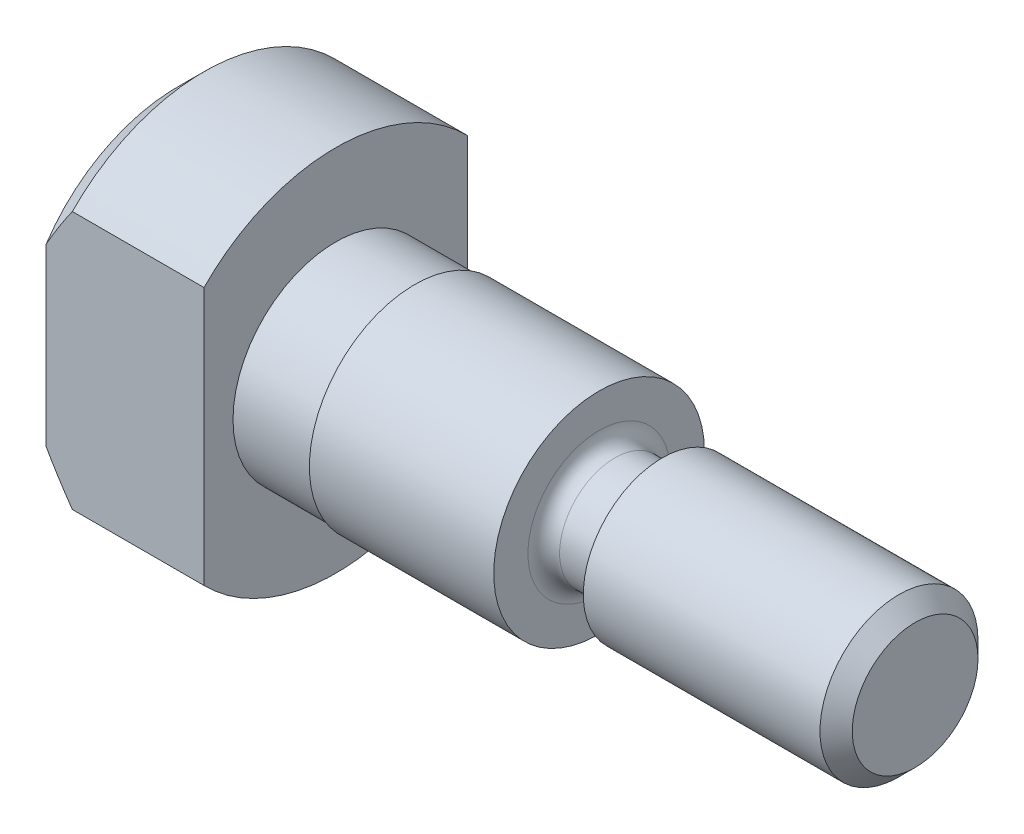
ISO-10303-21;
HEADER;
FILE_DESCRIPTION(('STEP AP214'),'2;1');
FILE_NAME('part.step','',(''),(''),'','','');
FILE_SCHEMA(('AUTOMOTIVE_DESIGN { 1 0 10303 214 1 1 1 1 }'));
ENDSEC;
DATA;
#1=APPLICATION_CONTEXT('core data for automotive mechanical design processes');
#2=APPLICATION_PROTOCOL_DEFINITION('international standard','automotive_design',2000,#1);
#3=PRODUCT_CONTEXT('',#1,'mechanical');
#4=PRODUCT('Part','Part','',(#3));
#5=PRODUCT_RELATED_PRODUCT_CATEGORY('part','',(#4));
#6=PRODUCT_DEFINITION_FORMATION('','',#4);
#7=PRODUCT_DEFINITION_CONTEXT('part definition',#1,'design');
#8=PRODUCT_DEFINITION('design','',#6,#7);
#9=PRODUCT_DEFINITION_SHAPE('','',#8);
#10=(LENGTH_UNIT() NAMED_UNIT(*) SI_UNIT(.MILLI.,.METRE.));
#11=(NAMED_UNIT(*) PLANE_ANGLE_UNIT() SI_UNIT($,.RADIAN.));
#12=(NAMED_UNIT(*) SI_UNIT($,.STERADIAN.) SOLID_ANGLE_UNIT());
#13=UNCERTAINTY_MEASURE_WITH_UNIT(LENGTH_MEASURE(1.E-05),#10,'distance_accuracy_value','');
#14=(GEOMETRIC_REPRESENTATION_CONTEXT(3) GLOBAL_UNCERTAINTY_ASSIGNED_CONTEXT((#13)) GLOBAL_UNIT_ASSIGNED_CONTEXT((#10,
#11,#12)) REPRESENTATION_CONTEXT('',''));
#15=CARTESIAN_POINT('',(0.,0.,0.));
#16=DIRECTION('',(0.,0.,1.));
#17=DIRECTION('',(1.,0.,0.));
#18=AXIS2_PLACEMENT_3D('',#15,#16,#17);
#19=CARTESIAN_POINT('',(0.,0.,0.));
#20=DIRECTION('',(-1.,0.,0.));
#21=DIRECTION('',(0.,0.,1.));
#22=AXIS2_PLACEMENT_3D('',#19,#20,#21);
#23=CYLINDRICAL_SURFACE('',#22,3.5);
#24=DIRECTION('',(-1.,0.,0.));
#25=VECTOR('',#24,1.);
#26=CARTESIAN_POINT('',(0.,-2.44948974278318,2.5));
#27=LINE('',#26,#25);
#28=CARTESIAN_POINT('',(0.,-2.44948974278318,2.5));
#29=VERTEX_POINT('',#28);
#30=CARTESIAN_POINT('',(-2.5,-2.44948974278318,2.5));
#31=VERTEX_POINT('',#30);
#32=EDGE_CURVE('E98',#29,#31,#27,.T.);
#33=ORIENTED_EDGE('',*,*,#32,.T.);
#34=CARTESIAN_POINT('',(-2.5,0.,0.));
#35=DIRECTION('',(-1.,0.,0.));
#36=DIRECTION('',(0.,0.,1.));
#37=AXIS2_PLACEMENT_3D('',#34,#35,#36);
#38=CIRCLE('',#37,3.5);
#39=CARTESIAN_POINT('',(-2.5,-2.44948974278318,-2.5));
#40=VERTEX_POINT('',#39);
#41=EDGE_CURVE('E268',#31,#40,#38,.F.);
#42=ORIENTED_EDGE('',*,*,#41,.T.);
#43=DIRECTION('',(-1.,0.,0.));
#44=VECTOR('',#43,1.);
#45=CARTESIAN_POINT('',(0.,-2.44948974278318,-2.5));
#46=LINE('',#45,#44);
#47=CARTESIAN_POINT('',(0.,-2.44948974278318,-2.5));
#48=VERTEX_POINT('',#47);
#49=EDGE_CURVE('E121',#48,#40,#46,.T.);
#50=ORIENTED_EDGE('',*,*,#49,.F.);
#51=CARTESIAN_POINT('',(0.,0.,0.));
#52=DIRECTION('',(-1.,0.,0.));
#53=DIRECTION('',(0.,0.,1.));
#54=AXIS2_PLACEMENT_3D('',#51,#52,#53);
#55=CIRCLE('',#54,3.5);
#56=EDGE_CURVE('E114',#48,#29,#55,.T.);
#57=ORIENTED_EDGE('',*,*,#56,.T.);
#58=EDGE_LOOP('',(#33,#42,#50,#57));
#59=FACE_BOUND('',#58,.T.);
#60=ADVANCED_FACE('F45',(#59),#23,.T.);
#61=CARTESIAN_POINT('',(0.,2.44948974278318,-2.5));
#62=DIRECTION('',(0.,0.,-1.));
#63=DIRECTION('',(-1.,0.,0.));
#64=AXIS2_PLACEMENT_3D('',#61,#62,#63);
#65=PLANE('',#64);
#66=DIRECTION('',(0.,-1.,0.));
#67=VECTOR('',#66,1.);
#68=CARTESIAN_POINT('',(-3.,2.44948974278318,-2.5));
#69=LINE('',#68,#67);
#70=CARTESIAN_POINT('',(-3.,1.65831239517771,-2.5));
#71=VERTEX_POINT('',#70);
#72=CARTESIAN_POINT('',(-3.,-1.65831239517771,-2.5));
#73=VERTEX_POINT('',#72);
#74=EDGE_CURVE('E123',#71,#73,#69,.T.);
#75=ORIENTED_EDGE('',*,*,#74,.F.);
#76=CARTESIAN_POINT('',(-3.,1.65831239517771,-2.5));
#77=CARTESIAN_POINT('',(-2.96221904765526,1.72663305453462,-2.5));
#78=CARTESIAN_POINT('',(-2.9232267435178,1.79426868492112,-2.5));
#79=CARTESIAN_POINT('',(-2.84321255461817,1.92826794919685,-2.5));
#80=CARTESIAN_POINT('',(-2.80219208094932,1.99463242410214,-2.5));
#81=CARTESIAN_POINT('',(-2.71846859510399,2.12627015614058,-2.5));
#82=CARTESIAN_POINT('',(-2.67576585629115,2.19154358813011,-2.5));
#83=CARTESIAN_POINT('',(-2.58890378473383,2.32118009299519,-2.5));
#84=CARTESIAN_POINT('',(-2.54474347372918,2.38554251126744,-2.5));
#85=CARTESIAN_POINT('',(-2.5,2.44948974278318,-2.5));
#86=B_SPLINE_CURVE_WITH_KNOTS('',3,(#76,#77,#78,#79,#80,#81,#82,#83,#84,#85),.UNSPECIFIED.,.F.,
.F.,(4,2,2,2,4),(0.,0.234182191466132,0.468203683204402,0.702187302671898,0.936331289706134),.UNSPECIFIED.);
#87=CARTESIAN_POINT('',(-2.5,2.44948974278318,-2.5));
#88=VERTEX_POINT('',#87);
#89=EDGE_CURVE('E173',#71,#88,#86,.T.);
#90=ORIENTED_EDGE('',*,*,#89,.T.);
#91=DIRECTION('',(-1.,0.,0.));
#92=VECTOR('',#91,1.);
#93=CARTESIAN_POINT('',(0.,2.44948974278318,-2.5));
#94=LINE('',#93,#92);
#95=CARTESIAN_POINT('',(0.,2.44948974278318,-2.5));
#96=VERTEX_POINT('',#95);
#97=EDGE_CURVE('E143',#96,#88,#94,.T.);
#98=ORIENTED_EDGE('',*,*,#97,.F.);
#99=DIRECTION('',(0.,-1.,0.));
#100=VECTOR('',#99,1.);
#101=CARTESIAN_POINT('',(0.,2.44948974278318,-2.5));
#102=LINE('',#101,#100);
#103=EDGE_CURVE('E107',#96,#48,#102,.T.);
#104=ORIENTED_EDGE('',*,*,#103,.T.);
#105=ORIENTED_EDGE('',*,*,#49,.T.);
#106=CARTESIAN_POINT('',(-2.5,-2.44948974278318,-2.5));
#107=CARTESIAN_POINT('',(-2.54474347372918,-2.38554251126744,-2.5));
#108=CARTESIAN_POINT('',(-2.58890378473383,-2.32118009299519,-2.5));
#109=CARTESIAN_POINT('',(-2.67576585629115,-2.19154358813011,-2.5));
#110=CARTESIAN_POINT('',(-2.71846859510399,-2.12627015614058,-2.5));
#111=CARTESIAN_POINT('',(-2.80219208094932,-1.99463242410214,-2.5));
#112=CARTESIAN_POINT('',(-2.84321255461817,-1.92826794919685,-2.5));
#113=CARTESIAN_POINT('',(-2.92322674351779,-1.79426868492112,-2.5));
#114=CARTESIAN_POINT('',(-2.96221904765526,-1.72663305453462,-2.5));
#115=CARTESIAN_POINT('',(-3.,-1.65831239517771,-2.5));
#116=B_SPLINE_CURVE_WITH_KNOTS('',3,(#106,#107,#108,#109,#110,#111,#112,#113,#114,#115),
.UNSPECIFIED.,.F.,.F.,(4,2,2,2,4),(0.,0.234143987034236,0.468127606501732,0.702149098240002,
0.936331289706134),.UNSPECIFIED.);
#117=EDGE_CURVE('E164',#40,#73,#116,.T.);
#118=ORIENTED_EDGE('',*,*,#117,.T.);
#119=EDGE_LOOP('',(#75,#90,#98,#104,#105,#118));
#120=FACE_BOUND('',#119,.T.);
#121=ADVANCED_FACE('F180',(#120),#65,.T.);
#122=CARTESIAN_POINT('',(0.,0.,0.));
#123=DIRECTION('',(-1.,0.,0.));
#124=DIRECTION('',(0.,0.,1.));
#125=AXIS2_PLACEMENT_3D('',#122,#123,#124);
#126=CYLINDRICAL_SURFACE('',#125,3.5);
#127=ORIENTED_EDGE('',*,*,#97,.T.);
#128=CARTESIAN_POINT('',(-2.5,0.,0.));
#129=DIRECTION('',(-1.,0.,0.));
#130=DIRECTION('',(0.,0.,1.));
#131=AXIS2_PLACEMENT_3D('',#128,#129,#130);
#132=CIRCLE('',#131,3.5);
#133=CARTESIAN_POINT('',(-2.5,2.44948974278318,2.5));
#134=VERTEX_POINT('',#133);
#135=EDGE_CURVE('E69',#88,#134,#132,.F.);
#136=ORIENTED_EDGE('',*,*,#135,.T.);
#137=DIRECTION('',(-1.,0.,0.));
#138=VECTOR('',#137,1.);
#139=CARTESIAN_POINT('',(0.,2.44948974278318,2.5));
#140=LINE('',#139,#138);
#141=CARTESIAN_POINT('',(0.,2.44948974278318,2.5));
#142=VERTEX_POINT('',#141);
#143=EDGE_CURVE('E106',#142,#134,#140,.T.);
#144=ORIENTED_EDGE('',*,*,#143,.F.);
#145=CARTESIAN_POINT('',(0.,0.,0.));
#146=DIRECTION('',(-1.,0.,0.));
#147=DIRECTION('',(0.,0.,1.));
#148=AXIS2_PLACEMENT_3D('',#145,#146,#147);
#149=CIRCLE('',#148,3.5);
#150=EDGE_CURVE('E117',#142,#96,#149,.T.);
#151=ORIENTED_EDGE('',*,*,#150,.T.);
#152=EDGE_LOOP('',(#127,#136,#144,#151));
#153=FACE_BOUND('',#152,.T.);
#154=ADVANCED_FACE('F214',(#153),#126,.T.);
#155=CARTESIAN_POINT('',(0.,-2.44948974278318,2.5));
#156=DIRECTION('',(0.,0.,1.));
#157=DIRECTION('',(1.,0.,0.));
#158=AXIS2_PLACEMENT_3D('',#155,#156,#157);
#159=PLANE('',#158);
#160=ORIENTED_EDGE('',*,*,#143,.T.);
#161=CARTESIAN_POINT('',(-2.5,2.44948974278318,2.5));
#162=CARTESIAN_POINT('',(-2.54474347372918,2.38554251126744,2.5));
#163=CARTESIAN_POINT('',(-2.58890378473383,2.32118009299519,2.5));
#164=CARTESIAN_POINT('',(-2.67576585629115,2.19154358813011,2.5));
#165=CARTESIAN_POINT('',(-2.71846859510399,2.12627015614058,2.5));
#166=CARTESIAN_POINT('',(-2.80219208094932,1.99463242410214,2.5));
#167=CARTESIAN_POINT('',(-2.84321255461817,1.92826794919685,2.5));
#168=CARTESIAN_POINT('',(-2.92322674351779,1.79426868492112,2.5));
#169=CARTESIAN_POINT('',(-2.96221904765526,1.72663305453462,2.5));
#170=CARTESIAN_POINT('',(-3.,1.65831239517771,2.5));
#171=B_SPLINE_CURVE_WITH_KNOTS('',3,(#161,#162,#163,#164,#165,#166,#167,#168,#169,#170),
.UNSPECIFIED.,.F.,.F.,(4,2,2,2,4),(0.,0.234143987034236,0.468127606501732,0.702149098240002,
0.936331289706134),.UNSPECIFIED.);
#172=CARTESIAN_POINT('',(-3.,1.65831239517771,2.5));
#173=VERTEX_POINT('',#172);
#174=EDGE_CURVE('E205',#134,#173,#171,.T.);
#175=ORIENTED_EDGE('',*,*,#174,.T.);
#176=DIRECTION('',(0.,1.,0.));
#177=VECTOR('',#176,1.);
#178=CARTESIAN_POINT('',(-3.,-2.44948974278318,2.5));
#179=LINE('',#178,#177);
#180=CARTESIAN_POINT('',(-3.,-1.65831239517771,2.5));
#181=VERTEX_POINT('',#180);
#182=EDGE_CURVE('E127',#181,#173,#179,.T.);
#183=ORIENTED_EDGE('',*,*,#182,.F.);
#184=CARTESIAN_POINT('',(-3.,-1.65831239517771,2.5));
#185=CARTESIAN_POINT('',(-2.96221904765526,-1.72663305453462,2.5));
#186=CARTESIAN_POINT('',(-2.9232267435178,-1.79426868492112,2.5));
#187=CARTESIAN_POINT('',(-2.84321255461817,-1.92826794919685,2.5));
#188=CARTESIAN_POINT('',(-2.80219208094932,-1.99463242410214,2.5));
#189=CARTESIAN_POINT('',(-2.71846859510399,-2.12627015614058,2.5));
#190=CARTESIAN_POINT('',(-2.67576585629115,-2.19154358813011,2.5));
#191=CARTESIAN_POINT('',(-2.58890378473383,-2.32118009299519,2.5));
#192=CARTESIAN_POINT('',(-2.54474347372918,-2.38554251126744,2.5));
#193=CARTESIAN_POINT('',(-2.5,-2.44948974278318,2.5));
#194=B_SPLINE_CURVE_WITH_KNOTS('',3,(#184,#185,#186,#187,#188,#189,#190,#191,#192,#193),
.UNSPECIFIED.,.F.,.F.,(4,2,2,2,4),(0.,0.234182191466132,0.468203683204402,0.702187302671898,
0.936331289706134),.UNSPECIFIED.);
#195=EDGE_CURVE('E61',#181,#31,#194,.T.);
#196=ORIENTED_EDGE('',*,*,#195,.T.);
#197=ORIENTED_EDGE('',*,*,#32,.F.);
#198=DIRECTION('',(0.,1.,0.));
#199=VECTOR('',#198,1.);
#200=CARTESIAN_POINT('',(0.,-2.44948974278318,2.5));
#201=LINE('',#200,#199);
#202=EDGE_CURVE('E101',#29,#142,#201,.T.);
#203=ORIENTED_EDGE('',*,*,#202,.T.);
#204=EDGE_LOOP('',(#160,#175,#183,#196,#197,#203));
#205=FACE_BOUND('',#204,.T.);
#206=ADVANCED_FACE('F100',(#205),#159,.T.);
#207=CARTESIAN_POINT('',(0.,0.,0.));
#208=DIRECTION('',(-1.,0.,0.));
#209=DIRECTION('',(0.,0.,1.));
#210=AXIS2_PLACEMENT_3D('',#207,#208,#209);
#211=PLANE('',#210);
#212=CARTESIAN_POINT('',(0.,0.,0.));
#213=DIRECTION('',(1.,0.,0.));
#214=DIRECTION('',(0.,0.,-1.));
#215=AXIS2_PLACEMENT_3D('',#212,#213,#214);
#216=CIRCLE('',#215,1.95);
#217=CARTESIAN_POINT('',(0.,0.,-1.95));
#218=VERTEX_POINT('',#217);
#219=EDGE_CURVE('E130',#218,#218,#216,.T.);
#220=ORIENTED_EDGE('',*,*,#219,.F.);
#221=EDGE_LOOP('',(#220));
#222=FACE_BOUND('',#221,.T.);
#223=ORIENTED_EDGE('',*,*,#56,.F.);
#224=ORIENTED_EDGE('',*,*,#103,.F.);
#225=ORIENTED_EDGE('',*,*,#150,.F.);
#226=ORIENTED_EDGE('',*,*,#202,.F.);
#227=EDGE_LOOP('',(#223,#224,#225,#226));
#228=FACE_BOUND('',#227,.T.);
#229=ADVANCED_FACE('F112',(#222,#228),#211,.F.);
#230=CARTESIAN_POINT('',(-3.,0.,0.));
#231=DIRECTION('',(-1.,0.,0.));
#232=DIRECTION('',(0.,0.,1.));
#233=AXIS2_PLACEMENT_3D('',#230,#231,#232);
#234=PLANE('',#233);
#235=ORIENTED_EDGE('',*,*,#182,.T.);
#236=CARTESIAN_POINT('',(-3.,0.,0.));
#237=DIRECTION('',(-1.,0.,0.));
#238=DIRECTION('',(0.,0.,1.));
#239=AXIS2_PLACEMENT_3D('',#236,#237,#238);
#240=CIRCLE('',#239,3.00000000000001);
#241=EDGE_CURVE('E160',#173,#71,#240,.T.);
#242=ORIENTED_EDGE('',*,*,#241,.T.);
#243=ORIENTED_EDGE('',*,*,#74,.T.);
#244=CARTESIAN_POINT('',(-3.,0.,0.));
#245=DIRECTION('',(-1.,0.,0.));
#246=DIRECTION('',(0.,0.,1.));
#247=AXIS2_PLACEMENT_3D('',#244,#245,#246);
#248=CIRCLE('',#247,3.00000000000001);
#249=EDGE_CURVE('E156',#73,#181,#248,.T.);
#250=ORIENTED_EDGE('',*,*,#249,.T.);
#251=EDGE_LOOP('',(#235,#242,#243,#250));
#252=FACE_BOUND('',#251,.T.);
#253=ADVANCED_FACE('F248',(#252),#234,.T.);
#254=CARTESIAN_POINT('',(0.,0.,0.));
#255=DIRECTION('',(1.,0.,0.));
#256=DIRECTION('',(0.,0.,-1.));
#257=AXIS2_PLACEMENT_3D('',#254,#255,#256);
#258=CYLINDRICAL_SURFACE('',#257,1.95);
#259=ORIENTED_EDGE('',*,*,#219,.T.);
#260=EDGE_LOOP('',(#259));
#261=FACE_BOUND('',#260,.T.);
#262=CARTESIAN_POINT('',(1.5,0.,0.));
#263=DIRECTION('',(1.,0.,0.));
#264=DIRECTION('',(0.,0.,-1.));
#265=AXIS2_PLACEMENT_3D('',#262,#263,#264);
#266=CIRCLE('',#265,1.95);
#267=CARTESIAN_POINT('',(1.5,0.,-1.95));
#268=VERTEX_POINT('',#267);
#269=EDGE_CURVE('E313',#268,#268,#266,.T.);
#270=ORIENTED_EDGE('',*,*,#269,.F.);
#271=EDGE_LOOP('',(#270));
#272=FACE_BOUND('',#271,.T.);
#273=ADVANCED_FACE('F239',(#261,#272),#258,.T.);
#274=CARTESIAN_POINT('',(11.,0.,0.));
#275=DIRECTION('',(1.,0.,0.));
#276=DIRECTION('',(0.,0.,-1.));
#277=AXIS2_PLACEMENT_3D('',#274,#275,#276);
#278=PLANE('',#277);
#279=CARTESIAN_POINT('',(11.,0.,0.));
#280=DIRECTION('',(1.,0.,0.));
#281=DIRECTION('',(0.,0.,-1.));
#282=AXIS2_PLACEMENT_3D('',#279,#280,#281);
#283=CIRCLE('',#282,1.19350000000001);
#284=CARTESIAN_POINT('',(11.,0.,-1.19350000000001));
#285=VERTEX_POINT('',#284);
#286=EDGE_CURVE('E148',#285,#285,#283,.T.);
#287=ORIENTED_EDGE('',*,*,#286,.T.);
#288=EDGE_LOOP('',(#287));
#289=FACE_BOUND('',#288,.T.);
#290=ADVANCED_FACE('F236',(#289),#278,.T.);
#291=CARTESIAN_POINT('',(0.,0.,0.));
#292=DIRECTION('',(1.,0.,0.));
#293=DIRECTION('',(0.,0.,-1.));
#294=AXIS2_PLACEMENT_3D('',#291,#292,#293);
#295=CYLINDRICAL_SURFACE('',#294,1.5);
#296=CARTESIAN_POINT('',(10.6935,0.,0.));
#297=DIRECTION('',(1.,0.,0.));
#298=DIRECTION('',(0.,0.,-1.));
#299=AXIS2_PLACEMENT_3D('',#296,#297,#298);
#300=CIRCLE('',#299,1.5);
#301=CARTESIAN_POINT('',(10.6935,0.,-1.5));
#302=VERTEX_POINT('',#301);
#303=EDGE_CURVE('E152',#302,#302,#300,.F.);
#304=ORIENTED_EDGE('',*,*,#303,.T.);
#305=EDGE_LOOP('',(#304));
#306=FACE_BOUND('',#305,.T.);
#307=CARTESIAN_POINT('',(6.2,0.,0.));
#308=DIRECTION('',(1.,0.,0.));
#309=DIRECTION('',(0.,0.,-1.));
#310=AXIS2_PLACEMENT_3D('',#307,#308,#309);
#311=CIRCLE('',#310,1.5);
#312=CARTESIAN_POINT('',(6.2,0.,-1.5));
#313=VERTEX_POINT('',#312);
#314=EDGE_CURVE('E139',#313,#313,#311,.T.);
#315=ORIENTED_EDGE('',*,*,#314,.T.);
#316=EDGE_LOOP('',(#315));
#317=FACE_BOUND('',#316,.T.);
#318=ADVANCED_FACE('F238',(#306,#317),#295,.T.);
#319=CARTESIAN_POINT('',(6.2,1.5,0.));
#320=DIRECTION('',(-1.,0.,0.));
#321=DIRECTION('',(0.,0.,1.));
#322=AXIS2_PLACEMENT_3D('',#319,#320,#321);
#323=PLANE('',#322);
#324=CARTESIAN_POINT('',(6.2,0.,0.));
#325=DIRECTION('',(-1.,0.,0.));
#326=DIRECTION('',(0.,0.,1.));
#327=AXIS2_PLACEMENT_3D('',#324,#325,#326);
#328=CIRCLE('',#327,1.34999999999988);
#329=CARTESIAN_POINT('',(6.2,0.,1.34999999999988));
#330=VERTEX_POINT('',#329);
#331=EDGE_CURVE('E11',#330,#330,#328,.F.);
#332=ORIENTED_EDGE('',*,*,#331,.T.);
#333=EDGE_LOOP('',(#332));
#334=FACE_BOUND('',#333,.T.);
#335=ORIENTED_EDGE('',*,*,#314,.F.);
#336=EDGE_LOOP('',(#335));
#337=FACE_BOUND('',#336,.T.);
#338=ADVANCED_FACE('F245',(#334,#337),#323,.T.);
#339=CARTESIAN_POINT('',(0.,0.,0.));
#340=DIRECTION('',(1.,0.,0.));
#341=DIRECTION('',(0.,0.,-1.));
#342=AXIS2_PLACEMENT_3D('',#339,#340,#341);
#343=CYLINDRICAL_SURFACE('',#342,1.05);
#344=CARTESIAN_POINT('',(5.29999999999988,0.,0.));
#345=DIRECTION('',(1.,0.,0.));
#346=DIRECTION('',(0.,0.,-1.));
#347=AXIS2_PLACEMENT_3D('',#344,#345,#346);
#348=CIRCLE('',#347,1.05);
#349=CARTESIAN_POINT('',(5.29999999999988,0.,-1.05));
#350=VERTEX_POINT('',#349);
#351=EDGE_CURVE('E273',#350,#350,#348,.T.);
#352=ORIENTED_EDGE('',*,*,#351,.T.);
#353=EDGE_LOOP('',(#352));
#354=FACE_BOUND('',#353,.T.);
#355=CARTESIAN_POINT('',(5.90000000000012,0.,0.));
#356=DIRECTION('',(-1.,0.,0.));
#357=DIRECTION('',(0.,0.,1.));
#358=AXIS2_PLACEMENT_3D('',#355,#356,#357);
#359=CIRCLE('',#358,1.05);
#360=CARTESIAN_POINT('',(5.90000000000012,0.,1.05));
#361=VERTEX_POINT('',#360);
#362=EDGE_CURVE('E270',#361,#361,#359,.T.);
#363=ORIENTED_EDGE('',*,*,#362,.T.);
#364=EDGE_LOOP('',(#363));
#365=FACE_BOUND('',#364,.T.);
#366=ADVANCED_FACE('F288',(#354,#365),#343,.T.);
#367=CARTESIAN_POINT('',(5.,1.05,0.));
#368=DIRECTION('',(1.,0.,0.));
#369=DIRECTION('',(0.,0.,-1.));
#370=AXIS2_PLACEMENT_3D('',#367,#368,#369);
#371=PLANE('',#370);
#372=CARTESIAN_POINT('',(5.,0.,0.));
#373=DIRECTION('',(1.,0.,0.));
#374=DIRECTION('',(0.,0.,-1.));
#375=AXIS2_PLACEMENT_3D('',#372,#373,#374);
#376=CIRCLE('',#375,1.34999999999988);
#377=CARTESIAN_POINT('',(5.,0.,-1.34999999999988));
#378=VERTEX_POINT('',#377);
#379=EDGE_CURVE('E54',#378,#378,#376,.F.);
#380=ORIENTED_EDGE('',*,*,#379,.T.);
#381=EDGE_LOOP('',(#380));
#382=FACE_BOUND('',#381,.T.);
#383=CARTESIAN_POINT('',(5.,0.,0.));
#384=DIRECTION('',(1.,0.,0.));
#385=DIRECTION('',(0.,0.,-1.));
#386=AXIS2_PLACEMENT_3D('',#383,#384,#385);
#387=CIRCLE('',#386,2.);
#388=CARTESIAN_POINT('',(5.,0.,-2.));
#389=VERTEX_POINT('',#388);
#390=EDGE_CURVE('E304',#389,#389,#387,.T.);
#391=ORIENTED_EDGE('',*,*,#390,.T.);
#392=EDGE_LOOP('',(#391));
#393=FACE_BOUND('',#392,.T.);
#394=ADVANCED_FACE('F281',(#382,#393),#371,.T.);
#395=CARTESIAN_POINT('',(0.,0.,0.));
#396=DIRECTION('',(1.,0.,0.));
#397=DIRECTION('',(0.,0.,-1.));
#398=AXIS2_PLACEMENT_3D('',#395,#396,#397);
#399=CYLINDRICAL_SURFACE('',#398,2.);
#400=CARTESIAN_POINT('',(1.5,0.,0.));
#401=DIRECTION('',(1.,0.,0.));
#402=DIRECTION('',(0.,0.,-1.));
#403=AXIS2_PLACEMENT_3D('',#400,#401,#402);
#404=CIRCLE('',#403,2.);
#405=CARTESIAN_POINT('',(1.5,0.,-2.));
#406=VERTEX_POINT('',#405);
#407=EDGE_CURVE('E307',#406,#406,#404,.T.);
#408=ORIENTED_EDGE('',*,*,#407,.T.);
#409=EDGE_LOOP('',(#408));
#410=FACE_BOUND('',#409,.T.);
#411=ORIENTED_EDGE('',*,*,#390,.F.);
#412=EDGE_LOOP('',(#411));
#413=FACE_BOUND('',#412,.T.);
#414=ADVANCED_FACE('F229',(#410,#413),#399,.T.);
#415=CARTESIAN_POINT('',(1.5,2.,0.));
#416=DIRECTION('',(-1.,0.,0.));
#417=DIRECTION('',(0.,0.,1.));
#418=AXIS2_PLACEMENT_3D('',#415,#416,#417);
#419=PLANE('',#418);
#420=ORIENTED_EDGE('',*,*,#269,.T.);
#421=EDGE_LOOP('',(#420));
#422=FACE_BOUND('',#421,.T.);
#423=ORIENTED_EDGE('',*,*,#407,.F.);
#424=EDGE_LOOP('',(#423));
#425=FACE_BOUND('',#424,.T.);
#426=ADVANCED_FACE('F222',(#422,#425),#419,.T.);
#427=CARTESIAN_POINT('',(11.,0.,0.));
#428=DIRECTION('',(-1.,0.,0.));
#429=DIRECTION('',(0.,0.,1.));
#430=AXIS2_PLACEMENT_3D('',#427,#428,#429);
#431=CONICAL_SURFACE('',#430,1.19350000000001,0.785398163397446);
#432=ORIENTED_EDGE('',*,*,#303,.F.);
#433=EDGE_LOOP('',(#432));
#434=FACE_BOUND('',#433,.T.);
#435=ORIENTED_EDGE('',*,*,#286,.F.);
#436=EDGE_LOOP('',(#435));
#437=FACE_BOUND('',#436,.T.);
#438=ADVANCED_FACE('F218',(#434,#437),#431,.T.);
#439=CARTESIAN_POINT('',(-3.,0.,0.));
#440=DIRECTION('',(1.,0.,0.));
#441=DIRECTION('',(0.,0.,-1.));
#442=AXIS2_PLACEMENT_3D('',#439,#440,#441);
#443=CONICAL_SURFACE('',#442,3.00000000000001,0.785398163397442);
#444=ORIENTED_EDGE('',*,*,#174,.F.);
#445=ORIENTED_EDGE('',*,*,#135,.F.);
#446=ORIENTED_EDGE('',*,*,#89,.F.);
#447=ORIENTED_EDGE('',*,*,#241,.F.);
#448=EDGE_LOOP('',(#444,#445,#446,#447));
#449=FACE_BOUND('',#448,.T.);
#450=ADVANCED_FACE('F192',(#449),#443,.T.);
#451=CARTESIAN_POINT('',(-3.,0.,0.));
#452=DIRECTION('',(1.,0.,0.));
#453=DIRECTION('',(0.,0.,-1.));
#454=AXIS2_PLACEMENT_3D('',#451,#452,#453);
#455=CONICAL_SURFACE('',#454,3.00000000000001,0.785398163397442);
#456=ORIENTED_EDGE('',*,*,#117,.F.);
#457=ORIENTED_EDGE('',*,*,#41,.F.);
#458=ORIENTED_EDGE('',*,*,#195,.F.);
#459=ORIENTED_EDGE('',*,*,#249,.F.);
#460=EDGE_LOOP('',(#456,#457,#458,#459));
#461=FACE_BOUND('',#460,.T.);
#462=ADVANCED_FACE('F185',(#461),#455,.T.);
#463=CARTESIAN_POINT('',(5.29999999999988,0.,0.));
#464=DIRECTION('',(1.,0.,0.));
#465=DIRECTION('',(0.,0.,-1.));
#466=AXIS2_PLACEMENT_3D('',#463,#464,#465);
#467=TOROIDAL_SURFACE('',#466,1.34999999999988,0.299999999999879);
#468=ORIENTED_EDGE('',*,*,#379,.F.);
#469=EDGE_LOOP('',(#468));
#470=FACE_BOUND('',#469,.T.);
#471=ORIENTED_EDGE('',*,*,#351,.F.);
#472=EDGE_LOOP('',(#471));
#473=FACE_BOUND('',#472,.T.);
#474=ADVANCED_FACE('F191',(#470,#473),#467,.F.);
#475=CARTESIAN_POINT('',(5.90000000000012,0.,0.));
#476=DIRECTION('',(-1.,0.,0.));
#477=DIRECTION('',(0.,0.,1.));
#478=AXIS2_PLACEMENT_3D('',#475,#476,#477);
#479=TOROIDAL_SURFACE('',#478,1.34999999999988,0.299999999999879);
#480=ORIENTED_EDGE('',*,*,#362,.F.);
#481=EDGE_LOOP('',(#480));
#482=FACE_BOUND('',#481,.T.);
#483=ORIENTED_EDGE('',*,*,#331,.F.);
#484=EDGE_LOOP('',(#483));
#485=FACE_BOUND('',#484,.T.);
#486=ADVANCED_FACE('F47',(#482,#485),#479,.F.);
#487=CLOSED_SHELL('',(#60,#121,#154,#206,#229,#253,#273,#290,#318,#338,#366,#394,#414,#426,#438,
#450,#462,#474,#486));
#488=MANIFOLD_SOLID_BREP('B2',#487);
#489=ADVANCED_BREP_SHAPE_REPRESENTATION('',(#18,#488),#14);
#490=SHAPE_DEFINITION_REPRESENTATION(#9,#489);
ENDSEC;
END-ISO-10303-21;
